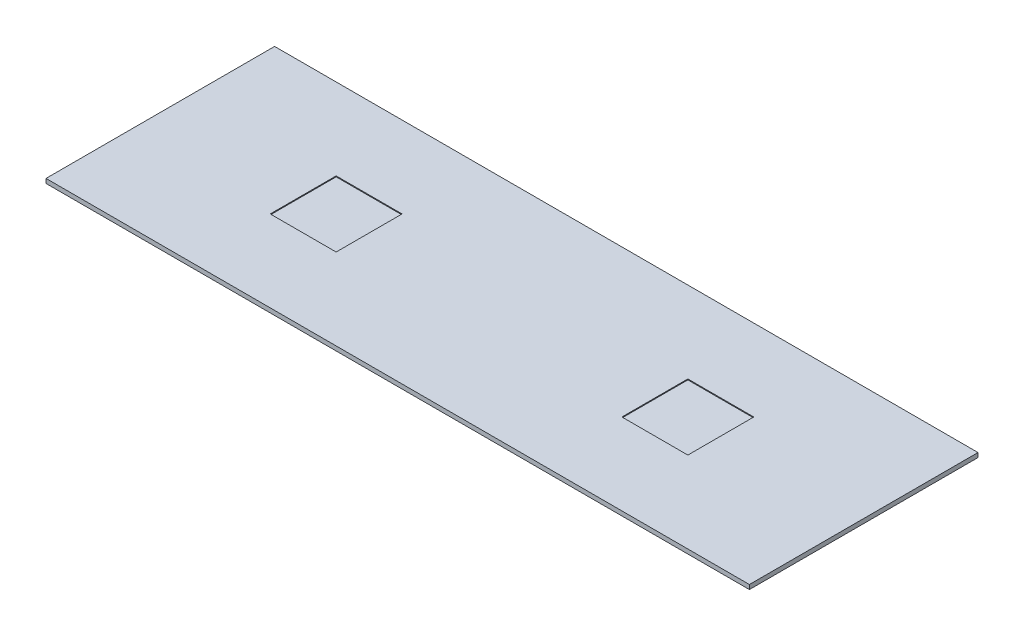
ISO-10303-21;
HEADER;
FILE_DESCRIPTION(('STEP AP214'),'2;1');
FILE_NAME('part.step','',(''),(''),'','','');
FILE_SCHEMA(('AUTOMOTIVE_DESIGN { 1 0 10303 214 1 1 1 1 }'));
ENDSEC;
DATA;
#1=APPLICATION_CONTEXT('core data for automotive mechanical design processes');
#2=APPLICATION_PROTOCOL_DEFINITION('international standard','automotive_design',2000,#1);
#3=PRODUCT_CONTEXT('',#1,'mechanical');
#4=PRODUCT('Part','Part','',(#3));
#5=PRODUCT_RELATED_PRODUCT_CATEGORY('part','',(#4));
#6=PRODUCT_DEFINITION_FORMATION('','',#4);
#7=PRODUCT_DEFINITION_CONTEXT('part definition',#1,'design');
#8=PRODUCT_DEFINITION('design','',#6,#7);
#9=PRODUCT_DEFINITION_SHAPE('','',#8);
#10=(LENGTH_UNIT() NAMED_UNIT(*) SI_UNIT(.MILLI.,.METRE.));
#11=(NAMED_UNIT(*) PLANE_ANGLE_UNIT() SI_UNIT($,.RADIAN.));
#12=(NAMED_UNIT(*) SI_UNIT($,.STERADIAN.) SOLID_ANGLE_UNIT());
#13=UNCERTAINTY_MEASURE_WITH_UNIT(LENGTH_MEASURE(1.E-05),#10,'distance_accuracy_value','');
#14=(GEOMETRIC_REPRESENTATION_CONTEXT(3) GLOBAL_UNCERTAINTY_ASSIGNED_CONTEXT((#13)) GLOBAL_UNIT_ASSIGNED_CONTEXT((#10,
#11,#12)) REPRESENTATION_CONTEXT('',''));
#15=CARTESIAN_POINT('',(0.,0.,0.));
#16=DIRECTION('',(0.,0.,1.));
#17=DIRECTION('',(1.,0.,0.));
#18=AXIS2_PLACEMENT_3D('',#15,#16,#17);
#19=CARTESIAN_POINT('',(-4000.,50.,1300.));
#20=DIRECTION('',(1.,0.,0.));
#21=DIRECTION('',(0.,0.,-1.));
#22=AXIS2_PLACEMENT_3D('',#19,#20,#21);
#23=PLANE('',#22);
#24=DIRECTION('',(0.,0.,1.));
#25=VECTOR('',#24,1.);
#26=CARTESIAN_POINT('',(-4000.,0.,1300.));
#27=LINE('',#26,#25);
#28=CARTESIAN_POINT('',(-4000.,0.,-1300.));
#29=VERTEX_POINT('',#28);
#30=CARTESIAN_POINT('',(-4000.,0.,1300.));
#31=VERTEX_POINT('',#30);
#32=EDGE_CURVE('E157',#29,#31,#27,.T.);
#33=ORIENTED_EDGE('',*,*,#32,.T.);
#34=DIRECTION('',(0.,-1.,0.));
#35=VECTOR('',#34,1.);
#36=CARTESIAN_POINT('',(-4000.,50.,1300.));
#37=LINE('',#36,#35);
#38=CARTESIAN_POINT('',(-4000.,50.,1300.));
#39=VERTEX_POINT('',#38);
#40=EDGE_CURVE('E11',#39,#31,#37,.T.);
#41=ORIENTED_EDGE('',*,*,#40,.F.);
#42=DIRECTION('',(0.,0.,1.));
#43=VECTOR('',#42,1.);
#44=CARTESIAN_POINT('',(-4000.,50.,1300.));
#45=LINE('',#44,#43);
#46=CARTESIAN_POINT('',(-4000.,50.,-1300.));
#47=VERTEX_POINT('',#46);
#48=EDGE_CURVE('E190',#47,#39,#45,.T.);
#49=ORIENTED_EDGE('',*,*,#48,.F.);
#50=DIRECTION('',(0.,-1.,0.));
#51=VECTOR('',#50,1.);
#52=CARTESIAN_POINT('',(-4000.,50.,-1300.));
#53=LINE('',#52,#51);
#54=EDGE_CURVE('E200',#47,#29,#53,.T.);
#55=ORIENTED_EDGE('',*,*,#54,.T.);
#56=EDGE_LOOP('',(#33,#41,#49,#55));
#57=FACE_BOUND('',#56,.T.);
#58=ADVANCED_FACE('F33',(#57),#23,.F.);
#59=CARTESIAN_POINT('',(4000.,50.,1300.));
#60=DIRECTION('',(0.,0.,-1.));
#61=DIRECTION('',(-1.,0.,0.));
#62=AXIS2_PLACEMENT_3D('',#59,#60,#61);
#63=PLANE('',#62);
#64=DIRECTION('',(1.,0.,0.));
#65=VECTOR('',#64,1.);
#66=CARTESIAN_POINT('',(4000.,0.,1300.));
#67=LINE('',#66,#65);
#68=CARTESIAN_POINT('',(4000.,0.,1300.));
#69=VERTEX_POINT('',#68);
#70=EDGE_CURVE('E203',#31,#69,#67,.T.);
#71=ORIENTED_EDGE('',*,*,#70,.T.);
#72=DIRECTION('',(0.,-1.,0.));
#73=VECTOR('',#72,1.);
#74=CARTESIAN_POINT('',(4000.,50.,1300.));
#75=LINE('',#74,#73);
#76=CARTESIAN_POINT('',(4000.,50.,1300.));
#77=VERTEX_POINT('',#76);
#78=EDGE_CURVE('E40',#77,#69,#75,.T.);
#79=ORIENTED_EDGE('',*,*,#78,.F.);
#80=DIRECTION('',(1.,0.,0.));
#81=VECTOR('',#80,1.);
#82=CARTESIAN_POINT('',(4000.,50.,1300.));
#83=LINE('',#82,#81);
#84=EDGE_CURVE('E193',#39,#77,#83,.T.);
#85=ORIENTED_EDGE('',*,*,#84,.F.);
#86=ORIENTED_EDGE('',*,*,#40,.T.);
#87=EDGE_LOOP('',(#71,#79,#85,#86));
#88=FACE_BOUND('',#87,.T.);
#89=ADVANCED_FACE('F233',(#88),#63,.F.);
#90=CARTESIAN_POINT('',(4000.,50.,1300.));
#91=DIRECTION('',(-1.,0.,0.));
#92=DIRECTION('',(0.,0.,1.));
#93=AXIS2_PLACEMENT_3D('',#90,#91,#92);
#94=PLANE('',#93);
#95=DIRECTION('',(0.,0.,-1.));
#96=VECTOR('',#95,1.);
#97=CARTESIAN_POINT('',(4000.,0.,1300.));
#98=LINE('',#97,#96);
#99=CARTESIAN_POINT('',(4000.,0.,-1300.));
#100=VERTEX_POINT('',#99);
#101=EDGE_CURVE('E205',#69,#100,#98,.T.);
#102=ORIENTED_EDGE('',*,*,#101,.T.);
#103=DIRECTION('',(0.,-1.,0.));
#104=VECTOR('',#103,1.);
#105=CARTESIAN_POINT('',(4000.,50.,-1300.));
#106=LINE('',#105,#104);
#107=CARTESIAN_POINT('',(4000.,50.,-1300.));
#108=VERTEX_POINT('',#107);
#109=EDGE_CURVE('E210',#108,#100,#106,.T.);
#110=ORIENTED_EDGE('',*,*,#109,.F.);
#111=DIRECTION('',(0.,0.,-1.));
#112=VECTOR('',#111,1.);
#113=CARTESIAN_POINT('',(4000.,50.,1300.));
#114=LINE('',#113,#112);
#115=EDGE_CURVE('E196',#77,#108,#114,.T.);
#116=ORIENTED_EDGE('',*,*,#115,.F.);
#117=ORIENTED_EDGE('',*,*,#78,.T.);
#118=EDGE_LOOP('',(#102,#110,#116,#117));
#119=FACE_BOUND('',#118,.T.);
#120=ADVANCED_FACE('F217',(#119),#94,.F.);
#121=CARTESIAN_POINT('',(4000.,50.,-1300.));
#122=DIRECTION('',(0.,0.,1.));
#123=DIRECTION('',(1.,0.,0.));
#124=AXIS2_PLACEMENT_3D('',#121,#122,#123);
#125=PLANE('',#124);
#126=DIRECTION('',(-1.,0.,0.));
#127=VECTOR('',#126,1.);
#128=CARTESIAN_POINT('',(4000.,0.,-1300.));
#129=LINE('',#128,#127);
#130=EDGE_CURVE('E194',#100,#29,#129,.T.);
#131=ORIENTED_EDGE('',*,*,#130,.T.);
#132=ORIENTED_EDGE('',*,*,#54,.F.);
#133=DIRECTION('',(-1.,0.,0.));
#134=VECTOR('',#133,1.);
#135=CARTESIAN_POINT('',(4000.,50.,-1300.));
#136=LINE('',#135,#134);
#137=EDGE_CURVE('E198',#108,#47,#136,.T.);
#138=ORIENTED_EDGE('',*,*,#137,.F.);
#139=ORIENTED_EDGE('',*,*,#109,.T.);
#140=EDGE_LOOP('',(#131,#132,#138,#139));
#141=FACE_BOUND('',#140,.T.);
#142=ADVANCED_FACE('F226',(#141),#125,.F.);
#143=CARTESIAN_POINT('',(0.,50.,0.));
#144=DIRECTION('',(0.,1.,0.));
#145=DIRECTION('',(0.,0.,1.));
#146=AXIS2_PLACEMENT_3D('',#143,#144,#145);
#147=PLANE('',#146);
#148=DIRECTION('',(0.,0.,1.));
#149=VECTOR('',#148,1.);
#150=CARTESIAN_POINT('',(-2375.,50.,375.));
#151=LINE('',#150,#149);
#152=CARTESIAN_POINT('',(-2375.,50.,-375.));
#153=VERTEX_POINT('',#152);
#154=CARTESIAN_POINT('',(-2375.,50.,375.));
#155=VERTEX_POINT('',#154);
#156=EDGE_CURVE('E47',#153,#155,#151,.T.);
#157=ORIENTED_EDGE('',*,*,#156,.F.);
#158=DIRECTION('',(-1.,0.,0.));
#159=VECTOR('',#158,1.);
#160=CARTESIAN_POINT('',(-1625.,50.,-375.));
#161=LINE('',#160,#159);
#162=CARTESIAN_POINT('',(-1625.,50.,-375.));
#163=VERTEX_POINT('',#162);
#164=EDGE_CURVE('E141',#163,#153,#161,.T.);
#165=ORIENTED_EDGE('',*,*,#164,.F.);
#166=DIRECTION('',(0.,0.,-1.));
#167=VECTOR('',#166,1.);
#168=CARTESIAN_POINT('',(-1625.,50.,375.));
#169=LINE('',#168,#167);
#170=CARTESIAN_POINT('',(-1625.,50.,375.));
#171=VERTEX_POINT('',#170);
#172=EDGE_CURVE('E144',#171,#163,#169,.T.);
#173=ORIENTED_EDGE('',*,*,#172,.F.);
#174=DIRECTION('',(1.,0.,0.));
#175=VECTOR('',#174,1.);
#176=CARTESIAN_POINT('',(-1625.,50.,375.));
#177=LINE('',#176,#175);
#178=EDGE_CURVE('E150',#155,#171,#177,.T.);
#179=ORIENTED_EDGE('',*,*,#178,.F.);
#180=EDGE_LOOP('',(#157,#165,#173,#179));
#181=FACE_BOUND('',#180,.T.);
#182=DIRECTION('',(0.,0.,1.));
#183=VECTOR('',#182,1.);
#184=CARTESIAN_POINT('',(1625.,50.,374.999999999999));
#185=LINE('',#184,#183);
#186=CARTESIAN_POINT('',(1625.,50.,-375.000000000001));
#187=VERTEX_POINT('',#186);
#188=CARTESIAN_POINT('',(1625.,50.,374.999999999999));
#189=VERTEX_POINT('',#188);
#190=EDGE_CURVE('E55',#187,#189,#185,.T.);
#191=ORIENTED_EDGE('',*,*,#190,.F.);
#192=DIRECTION('',(-1.,0.,0.));
#193=VECTOR('',#192,1.);
#194=CARTESIAN_POINT('',(2375.,50.,-375.000000000001));
#195=LINE('',#194,#193);
#196=CARTESIAN_POINT('',(2375.,50.,-375.000000000001));
#197=VERTEX_POINT('',#196);
#198=EDGE_CURVE('E165',#197,#187,#195,.T.);
#199=ORIENTED_EDGE('',*,*,#198,.F.);
#200=DIRECTION('',(0.,0.,-1.));
#201=VECTOR('',#200,1.);
#202=CARTESIAN_POINT('',(2375.,50.,374.999999999999));
#203=LINE('',#202,#201);
#204=CARTESIAN_POINT('',(2375.,50.,374.999999999999));
#205=VERTEX_POINT('',#204);
#206=EDGE_CURVE('E179',#205,#197,#203,.T.);
#207=ORIENTED_EDGE('',*,*,#206,.F.);
#208=DIRECTION('',(1.,0.,0.));
#209=VECTOR('',#208,1.);
#210=CARTESIAN_POINT('',(2375.,50.,374.999999999999));
#211=LINE('',#210,#209);
#212=EDGE_CURVE('E176',#189,#205,#211,.T.);
#213=ORIENTED_EDGE('',*,*,#212,.F.);
#214=EDGE_LOOP('',(#191,#199,#207,#213));
#215=FACE_BOUND('',#214,.T.);
#216=ORIENTED_EDGE('',*,*,#48,.T.);
#217=ORIENTED_EDGE('',*,*,#84,.T.);
#218=ORIENTED_EDGE('',*,*,#115,.T.);
#219=ORIENTED_EDGE('',*,*,#137,.T.);
#220=EDGE_LOOP('',(#216,#217,#218,#219));
#221=FACE_BOUND('',#220,.T.);
#222=ADVANCED_FACE('F232',(#181,#215,#221),#147,.T.);
#223=CARTESIAN_POINT('',(0.,0.,0.));
#224=DIRECTION('',(0.,1.,0.));
#225=DIRECTION('',(0.,0.,1.));
#226=AXIS2_PLACEMENT_3D('',#223,#224,#225);
#227=PLANE('',#226);
#228=ORIENTED_EDGE('',*,*,#32,.F.);
#229=ORIENTED_EDGE('',*,*,#130,.F.);
#230=ORIENTED_EDGE('',*,*,#101,.F.);
#231=ORIENTED_EDGE('',*,*,#70,.F.);
#232=EDGE_LOOP('',(#228,#229,#230,#231));
#233=FACE_BOUND('',#232,.T.);
#234=ADVANCED_FACE('F223',(#233),#227,.F.);
#235=CARTESIAN_POINT('',(1625.,40.,374.999999999999));
#236=DIRECTION('',(-1.,0.,0.));
#237=DIRECTION('',(0.,0.,1.));
#238=AXIS2_PLACEMENT_3D('',#235,#236,#237);
#239=PLANE('',#238);
#240=ORIENTED_EDGE('',*,*,#190,.T.);
#241=DIRECTION('',(0.,1.,0.));
#242=VECTOR('',#241,1.);
#243=CARTESIAN_POINT('',(1625.,40.,374.999999999999));
#244=LINE('',#243,#242);
#245=CARTESIAN_POINT('',(1625.,40.,374.999999999999));
#246=VERTEX_POINT('',#245);
#247=EDGE_CURVE('E174',#246,#189,#244,.T.);
#248=ORIENTED_EDGE('',*,*,#247,.F.);
#249=DIRECTION('',(0.,0.,1.));
#250=VECTOR('',#249,1.);
#251=CARTESIAN_POINT('',(1625.,40.,374.999999999999));
#252=LINE('',#251,#250);
#253=CARTESIAN_POINT('',(1625.,40.,-375.000000000001));
#254=VERTEX_POINT('',#253);
#255=EDGE_CURVE('E161',#254,#246,#252,.T.);
#256=ORIENTED_EDGE('',*,*,#255,.F.);
#257=DIRECTION('',(0.,1.,0.));
#258=VECTOR('',#257,1.);
#259=CARTESIAN_POINT('',(1625.,40.,-375.000000000001));
#260=LINE('',#259,#258);
#261=EDGE_CURVE('E151',#254,#187,#260,.T.);
#262=ORIENTED_EDGE('',*,*,#261,.T.);
#263=EDGE_LOOP('',(#240,#248,#256,#262));
#264=FACE_BOUND('',#263,.T.);
#265=ADVANCED_FACE('F245',(#264),#239,.F.);
#266=CARTESIAN_POINT('',(2375.,40.,-375.000000000001));
#267=DIRECTION('',(0.,0.,-1.));
#268=DIRECTION('',(-1.,0.,0.));
#269=AXIS2_PLACEMENT_3D('',#266,#267,#268);
#270=PLANE('',#269);
#271=ORIENTED_EDGE('',*,*,#198,.T.);
#272=ORIENTED_EDGE('',*,*,#261,.F.);
#273=DIRECTION('',(-1.,0.,0.));
#274=VECTOR('',#273,1.);
#275=CARTESIAN_POINT('',(2375.,40.,-375.000000000001));
#276=LINE('',#275,#274);
#277=CARTESIAN_POINT('',(2375.,40.,-375.000000000001));
#278=VERTEX_POINT('',#277);
#279=EDGE_CURVE('E171',#278,#254,#276,.T.);
#280=ORIENTED_EDGE('',*,*,#279,.F.);
#281=DIRECTION('',(0.,1.,0.));
#282=VECTOR('',#281,1.);
#283=CARTESIAN_POINT('',(2375.,40.,-375.000000000001));
#284=LINE('',#283,#282);
#285=EDGE_CURVE('E185',#278,#197,#284,.T.);
#286=ORIENTED_EDGE('',*,*,#285,.T.);
#287=EDGE_LOOP('',(#271,#272,#280,#286));
#288=FACE_BOUND('',#287,.T.);
#289=ADVANCED_FACE('F251',(#288),#270,.F.);
#290=CARTESIAN_POINT('',(2375.,40.,374.999999999999));
#291=DIRECTION('',(1.,0.,0.));
#292=DIRECTION('',(0.,0.,-1.));
#293=AXIS2_PLACEMENT_3D('',#290,#291,#292);
#294=PLANE('',#293);
#295=ORIENTED_EDGE('',*,*,#206,.T.);
#296=ORIENTED_EDGE('',*,*,#285,.F.);
#297=DIRECTION('',(0.,0.,-1.));
#298=VECTOR('',#297,1.);
#299=CARTESIAN_POINT('',(2375.,40.,374.999999999999));
#300=LINE('',#299,#298);
#301=CARTESIAN_POINT('',(2375.,40.,374.999999999999));
#302=VERTEX_POINT('',#301);
#303=EDGE_CURVE('E168',#302,#278,#300,.T.);
#304=ORIENTED_EDGE('',*,*,#303,.F.);
#305=DIRECTION('',(0.,1.,0.));
#306=VECTOR('',#305,1.);
#307=CARTESIAN_POINT('',(2375.,40.,374.999999999999));
#308=LINE('',#307,#306);
#309=EDGE_CURVE('E187',#302,#205,#308,.T.);
#310=ORIENTED_EDGE('',*,*,#309,.T.);
#311=EDGE_LOOP('',(#295,#296,#304,#310));
#312=FACE_BOUND('',#311,.T.);
#313=ADVANCED_FACE('F256',(#312),#294,.F.);
#314=CARTESIAN_POINT('',(2375.,40.,374.999999999999));
#315=DIRECTION('',(0.,0.,1.));
#316=DIRECTION('',(1.,0.,0.));
#317=AXIS2_PLACEMENT_3D('',#314,#315,#316);
#318=PLANE('',#317);
#319=ORIENTED_EDGE('',*,*,#212,.T.);
#320=ORIENTED_EDGE('',*,*,#309,.F.);
#321=DIRECTION('',(1.,0.,0.));
#322=VECTOR('',#321,1.);
#323=CARTESIAN_POINT('',(2375.,40.,374.999999999999));
#324=LINE('',#323,#322);
#325=EDGE_CURVE('E164',#246,#302,#324,.T.);
#326=ORIENTED_EDGE('',*,*,#325,.F.);
#327=ORIENTED_EDGE('',*,*,#247,.T.);
#328=EDGE_LOOP('',(#319,#320,#326,#327));
#329=FACE_BOUND('',#328,.T.);
#330=ADVANCED_FACE('F252',(#329),#318,.F.);
#331=CARTESIAN_POINT('',(0.,40.,0.));
#332=DIRECTION('',(0.,1.,0.));
#333=DIRECTION('',(0.,0.,1.));
#334=AXIS2_PLACEMENT_3D('',#331,#332,#333);
#335=PLANE('',#334);
#336=ORIENTED_EDGE('',*,*,#255,.T.);
#337=ORIENTED_EDGE('',*,*,#325,.T.);
#338=ORIENTED_EDGE('',*,*,#303,.T.);
#339=ORIENTED_EDGE('',*,*,#279,.T.);
#340=EDGE_LOOP('',(#336,#337,#338,#339));
#341=FACE_BOUND('',#340,.T.);
#342=ADVANCED_FACE('F255',(#341),#335,.T.);
#343=CARTESIAN_POINT('',(-2375.,40.,375.));
#344=DIRECTION('',(-1.,0.,0.));
#345=DIRECTION('',(0.,0.,1.));
#346=AXIS2_PLACEMENT_3D('',#343,#344,#345);
#347=PLANE('',#346);
#348=ORIENTED_EDGE('',*,*,#156,.T.);
#349=DIRECTION('',(0.,1.,0.));
#350=VECTOR('',#349,1.);
#351=CARTESIAN_POINT('',(-2375.,40.,375.));
#352=LINE('',#351,#350);
#353=CARTESIAN_POINT('',(-2375.,40.,375.));
#354=VERTEX_POINT('',#353);
#355=EDGE_CURVE('E119',#354,#155,#352,.T.);
#356=ORIENTED_EDGE('',*,*,#355,.F.);
#357=DIRECTION('',(0.,0.,1.));
#358=VECTOR('',#357,1.);
#359=CARTESIAN_POINT('',(-2375.,40.,375.));
#360=LINE('',#359,#358);
#361=CARTESIAN_POINT('',(-2375.,40.,-375.));
#362=VERTEX_POINT('',#361);
#363=EDGE_CURVE('E123',#362,#354,#360,.T.);
#364=ORIENTED_EDGE('',*,*,#363,.F.);
#365=DIRECTION('',(0.,1.,0.));
#366=VECTOR('',#365,1.);
#367=CARTESIAN_POINT('',(-2375.,40.,-375.));
#368=LINE('',#367,#366);
#369=EDGE_CURVE('E155',#362,#153,#368,.T.);
#370=ORIENTED_EDGE('',*,*,#369,.T.);
#371=EDGE_LOOP('',(#348,#356,#364,#370));
#372=FACE_BOUND('',#371,.T.);
#373=ADVANCED_FACE('F121',(#372),#347,.F.);
#374=CARTESIAN_POINT('',(-1625.,40.,-375.));
#375=DIRECTION('',(0.,0.,-1.));
#376=DIRECTION('',(-1.,0.,0.));
#377=AXIS2_PLACEMENT_3D('',#374,#375,#376);
#378=PLANE('',#377);
#379=ORIENTED_EDGE('',*,*,#164,.T.);
#380=ORIENTED_EDGE('',*,*,#369,.F.);
#381=DIRECTION('',(-1.,0.,0.));
#382=VECTOR('',#381,1.);
#383=CARTESIAN_POINT('',(-1625.,40.,-375.));
#384=LINE('',#383,#382);
#385=CARTESIAN_POINT('',(-1625.,40.,-375.));
#386=VERTEX_POINT('',#385);
#387=EDGE_CURVE('E129',#386,#362,#384,.T.);
#388=ORIENTED_EDGE('',*,*,#387,.F.);
#389=DIRECTION('',(0.,1.,0.));
#390=VECTOR('',#389,1.);
#391=CARTESIAN_POINT('',(-1625.,40.,-375.));
#392=LINE('',#391,#390);
#393=EDGE_CURVE('E158',#386,#163,#392,.T.);
#394=ORIENTED_EDGE('',*,*,#393,.T.);
#395=EDGE_LOOP('',(#379,#380,#388,#394));
#396=FACE_BOUND('',#395,.T.);
#397=ADVANCED_FACE('F269',(#396),#378,.F.);
#398=CARTESIAN_POINT('',(-1625.,40.,375.));
#399=DIRECTION('',(1.,0.,0.));
#400=DIRECTION('',(0.,0.,-1.));
#401=AXIS2_PLACEMENT_3D('',#398,#399,#400);
#402=PLANE('',#401);
#403=ORIENTED_EDGE('',*,*,#172,.T.);
#404=ORIENTED_EDGE('',*,*,#393,.F.);
#405=DIRECTION('',(0.,0.,-1.));
#406=VECTOR('',#405,1.);
#407=CARTESIAN_POINT('',(-1625.,40.,375.));
#408=LINE('',#407,#406);
#409=CARTESIAN_POINT('',(-1625.,40.,375.));
#410=VERTEX_POINT('',#409);
#411=EDGE_CURVE('E137',#410,#386,#408,.T.);
#412=ORIENTED_EDGE('',*,*,#411,.F.);
#413=DIRECTION('',(0.,1.,0.));
#414=VECTOR('',#413,1.);
#415=CARTESIAN_POINT('',(-1625.,40.,375.));
#416=LINE('',#415,#414);
#417=EDGE_CURVE('E128',#410,#171,#416,.T.);
#418=ORIENTED_EDGE('',*,*,#417,.T.);
#419=EDGE_LOOP('',(#403,#404,#412,#418));
#420=FACE_BOUND('',#419,.T.);
#421=ADVANCED_FACE('F272',(#420),#402,.F.);
#422=CARTESIAN_POINT('',(-1625.,40.,375.));
#423=DIRECTION('',(0.,0.,1.));
#424=DIRECTION('',(1.,0.,0.));
#425=AXIS2_PLACEMENT_3D('',#422,#423,#424);
#426=PLANE('',#425);
#427=ORIENTED_EDGE('',*,*,#178,.T.);
#428=ORIENTED_EDGE('',*,*,#417,.F.);
#429=DIRECTION('',(1.,0.,0.));
#430=VECTOR('',#429,1.);
#431=CARTESIAN_POINT('',(-1625.,40.,375.));
#432=LINE('',#431,#430);
#433=EDGE_CURVE('E132',#354,#410,#432,.T.);
#434=ORIENTED_EDGE('',*,*,#433,.F.);
#435=ORIENTED_EDGE('',*,*,#355,.T.);
#436=EDGE_LOOP('',(#427,#428,#434,#435));
#437=FACE_BOUND('',#436,.T.);
#438=ADVANCED_FACE('F133',(#437),#426,.F.);
#439=CARTESIAN_POINT('',(0.,40.,0.));
#440=DIRECTION('',(0.,1.,0.));
#441=DIRECTION('',(0.,0.,1.));
#442=AXIS2_PLACEMENT_3D('',#439,#440,#441);
#443=PLANE('',#442);
#444=ORIENTED_EDGE('',*,*,#363,.T.);
#445=ORIENTED_EDGE('',*,*,#433,.T.);
#446=ORIENTED_EDGE('',*,*,#411,.T.);
#447=ORIENTED_EDGE('',*,*,#387,.T.);
#448=EDGE_LOOP('',(#444,#445,#446,#447));
#449=FACE_BOUND('',#448,.T.);
#450=ADVANCED_FACE('F139',(#449),#443,.T.);
#451=CLOSED_SHELL('',(#58,#89,#120,#142,#222,#234,#265,#289,#313,#330,#342,#373,#397,#421,#438,#450));
#452=MANIFOLD_SOLID_BREP('B2',#451);
#453=ADVANCED_BREP_SHAPE_REPRESENTATION('',(#18,#452),#14);
#454=SHAPE_DEFINITION_REPRESENTATION(#9,#453);
ENDSEC;
END-ISO-10303-21;
